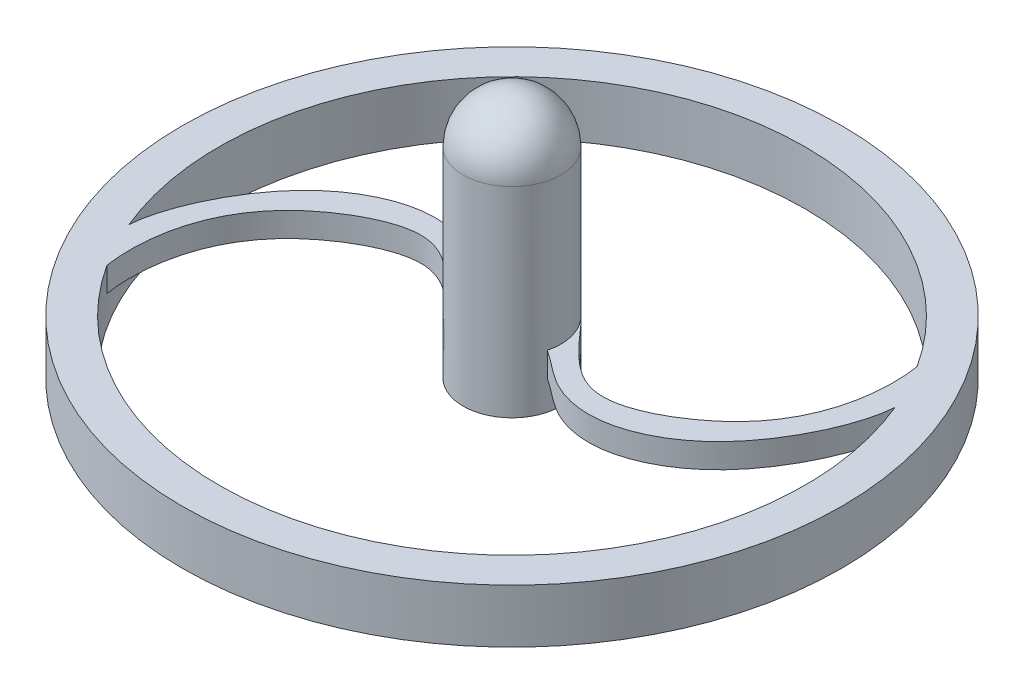
ISO-10303-21;
HEADER;
FILE_DESCRIPTION(('STEP AP214'),'2;1');
FILE_NAME('part.step','',(''),(''),'','','');
FILE_SCHEMA(('AUTOMOTIVE_DESIGN { 1 0 10303 214 1 1 1 1 }'));
ENDSEC;
DATA;
#1=APPLICATION_CONTEXT('core data for automotive mechanical design processes');
#2=APPLICATION_PROTOCOL_DEFINITION('international standard','automotive_design',2000,#1);
#3=PRODUCT_CONTEXT('',#1,'mechanical');
#4=PRODUCT('Part','Part','',(#3));
#5=PRODUCT_RELATED_PRODUCT_CATEGORY('part','',(#4));
#6=PRODUCT_DEFINITION_FORMATION('','',#4);
#7=PRODUCT_DEFINITION_CONTEXT('part definition',#1,'design');
#8=PRODUCT_DEFINITION('design','',#6,#7);
#9=PRODUCT_DEFINITION_SHAPE('','',#8);
#10=(LENGTH_UNIT() NAMED_UNIT(*) SI_UNIT(.MILLI.,.METRE.));
#11=(NAMED_UNIT(*) PLANE_ANGLE_UNIT() SI_UNIT($,.RADIAN.));
#12=(NAMED_UNIT(*) SI_UNIT($,.STERADIAN.) SOLID_ANGLE_UNIT());
#13=UNCERTAINTY_MEASURE_WITH_UNIT(LENGTH_MEASURE(1.E-05),#10,'distance_accuracy_value','');
#14=(GEOMETRIC_REPRESENTATION_CONTEXT(3) GLOBAL_UNCERTAINTY_ASSIGNED_CONTEXT((#13)) GLOBAL_UNIT_ASSIGNED_CONTEXT((#10,
#11,#12)) REPRESENTATION_CONTEXT('',''));
#15=CARTESIAN_POINT('',(0.,0.,0.));
#16=DIRECTION('',(0.,0.,1.));
#17=DIRECTION('',(1.,0.,0.));
#18=AXIS2_PLACEMENT_3D('',#15,#16,#17);
#19=CARTESIAN_POINT('',(0.,0.,0.));
#20=DIRECTION('',(0.,1.,0.));
#21=DIRECTION('',(0.,0.,1.));
#22=AXIS2_PLACEMENT_3D('',#19,#20,#21);
#23=PLANE('',#22);
#24=CARTESIAN_POINT('',(0.,0.,0.));
#25=DIRECTION('',(0.,-1.,0.));
#26=DIRECTION('',(0.,0.,-1.));
#27=AXIS2_PLACEMENT_3D('',#24,#25,#26);
#28=CIRCLE('',#27,2.);
#29=CARTESIAN_POINT('',(-1.16256568490466,0.,1.62740315480896));
#30=VERTEX_POINT('',#29);
#31=CARTESIAN_POINT('',(-1.93836135171429,0.,-0.492702009515219));
#32=VERTEX_POINT('',#31);
#33=EDGE_CURVE('E118',#30,#32,#28,.T.);
#34=ORIENTED_EDGE('',*,*,#33,.F.);
#35=CARTESIAN_POINT('',(-10.0854850638004,0.,6.5033930738959));
#36=CARTESIAN_POINT('',(-10.0854218085389,0.,6.50320334047269));
#37=CARTESIAN_POINT('',(-10.0853585532773,0.,6.50301360704947));
#38=CARTESIAN_POINT('',(-10.0852952980157,0.,6.50282387362626));
#39=CARTESIAN_POINT('',(-10.0842533998892,0.,6.49969871228324));
#40=CARTESIAN_POINT('',(-10.9818624529143,0.,2.08534550251094));
#41=CARTESIAN_POINT('',(-5.36627081813513,0.,-1.29229015669649));
#42=CARTESIAN_POINT('',(-2.94758233561727,0.,-0.67177594075878));
#43=CARTESIAN_POINT('',(-1.6606104801702,0.,1.32002450229677));
#44=CARTESIAN_POINT('',(-1.16256568490466,0.,1.62740315480896));
#45=B_SPLINE_CURVE_WITH_KNOTS('',3,(#35,#36,#37,#38,#39,#40,#41,#42,#43,#44),.UNSPECIFIED.,.F.,
.F.,(4,3,1,1,1,4),(-0.0286616399057449,0.000521976231546366,0.481214873968471,0.664290716261165,
0.779225909611428,1.),.UNSPECIFIED.);
#46=CARTESIAN_POINT('',(-10.0853009999482,0.,6.50282275173211));
#47=VERTEX_POINT('',#46);
#48=EDGE_CURVE('E235',#47,#30,#45,.T.);
#49=ORIENTED_EDGE('',*,*,#48,.F.);
#50=CARTESIAN_POINT('',(0.,0.,0.));
#51=DIRECTION('',(0.,-1.,0.));
#52=DIRECTION('',(0.,0.,-1.));
#53=AXIS2_PLACEMENT_3D('',#50,#51,#52);
#54=CIRCLE('',#53,12.);
#55=CARTESIAN_POINT('',(-11.0822901967786,0.,4.60248237306618));
#56=VERTEX_POINT('',#55);
#57=EDGE_CURVE('E11',#47,#56,#54,.T.);
#58=ORIENTED_EDGE('',*,*,#57,.T.);
#59=CARTESIAN_POINT('',(-1.93836135171429,0.,-0.492702009515219));
#60=CARTESIAN_POINT('',(-2.52199460928083,0.,-0.852903354489393));
#61=CARTESIAN_POINT('',(-3.25646540853267,0.,-1.6835347590675));
#62=CARTESIAN_POINT('',(-5.88510092905891,0.,-2.14010059100438));
#63=CARTESIAN_POINT('',(-9.31960687069204,0.,-0.459678320471755));
#64=CARTESIAN_POINT('',(-11.0084041898084,0.,3.34807400884886));
#65=CARTESIAN_POINT('',(-11.0822901967786,0.,4.60248237306619));
#66=B_SPLINE_CURVE_WITH_KNOTS('',3,(#59,#60,#61,#62,#63,#64,#65),.UNSPECIFIED.,.F.,.F.,(4,1,1,1,
4),(0.,0.258713880673113,0.388227573111131,0.692598248431942,1.),.UNSPECIFIED.);
#67=EDGE_CURVE('E358',#32,#56,#66,.T.);
#68=ORIENTED_EDGE('',*,*,#67,.F.);
#69=EDGE_LOOP('',(#34,#49,#58,#68));
#70=FACE_BOUND('',#69,.T.);
#71=ADVANCED_FACE('F39',(#70),#23,.F.);
#72=CARTESIAN_POINT('',(1.16256568490466,0.,-1.62740315480896));
#73=VERTEX_POINT('',#72);
#74=CARTESIAN_POINT('',(1.93836135171429,0.,0.492702009515219));
#75=VERTEX_POINT('',#74);
#76=EDGE_CURVE('E106',#73,#75,#28,.T.);
#77=ORIENTED_EDGE('',*,*,#76,.F.);
#78=CARTESIAN_POINT('',(10.0854850638004,0.,-6.5033930738959));
#79=CARTESIAN_POINT('',(10.0854218085389,0.,-6.50320334047269));
#80=CARTESIAN_POINT('',(10.0853585532773,0.,-6.50301360704947));
#81=CARTESIAN_POINT('',(10.0852952980157,0.,-6.50282387362626));
#82=CARTESIAN_POINT('',(10.0842533998892,0.,-6.49969871228324));
#83=CARTESIAN_POINT('',(10.9818624529143,0.,-2.08534550251094));
#84=CARTESIAN_POINT('',(5.36627081813513,0.,1.29229015669649));
#85=CARTESIAN_POINT('',(2.94758233561727,0.,0.67177594075878));
#86=CARTESIAN_POINT('',(1.6606104801702,0.,-1.32002450229677));
#87=CARTESIAN_POINT('',(1.16256568490466,0.,-1.62740315480896));
#88=B_SPLINE_CURVE_WITH_KNOTS('',3,(#78,#79,#80,#81,#82,#83,#84,#85,#86,#87),.UNSPECIFIED.,.F.,
.F.,(4,3,1,1,1,4),(-0.0286616399057449,0.000521976231546366,0.481214873968471,0.664290716261165,
0.779225909611428,1.),.UNSPECIFIED.);
#89=CARTESIAN_POINT('',(10.0853009999482,0.,-6.50282275173211));
#90=VERTEX_POINT('',#89);
#91=EDGE_CURVE('E109',#90,#73,#88,.T.);
#92=ORIENTED_EDGE('',*,*,#91,.F.);
#93=CARTESIAN_POINT('',(11.0822901967786,0.,-4.60248237306619));
#94=VERTEX_POINT('',#93);
#95=EDGE_CURVE('E190',#90,#94,#54,.T.);
#96=ORIENTED_EDGE('',*,*,#95,.T.);
#97=CARTESIAN_POINT('',(1.93836135171429,0.,0.492702009515219));
#98=CARTESIAN_POINT('',(2.52199460928083,0.,0.852903354489393));
#99=CARTESIAN_POINT('',(3.25646540853267,0.,1.6835347590675));
#100=CARTESIAN_POINT('',(5.88510092905891,0.,2.14010059100438));
#101=CARTESIAN_POINT('',(9.31960687069204,0.,0.459678320471755));
#102=CARTESIAN_POINT('',(11.0084041898084,0.,-3.34807400884886));
#103=CARTESIAN_POINT('',(11.0822901967786,0.,-4.60248237306619));
#104=B_SPLINE_CURVE_WITH_KNOTS('',3,(#97,#98,#99,#100,#101,#102,#103),.UNSPECIFIED.,.F.,.F.,(4,
1,1,1,4),(0.,0.258713880673113,0.388227573111131,0.692598248431942,1.),.UNSPECIFIED.);
#105=EDGE_CURVE('E112',#75,#94,#104,.T.);
#106=ORIENTED_EDGE('',*,*,#105,.F.);
#107=EDGE_LOOP('',(#77,#92,#96,#106));
#108=FACE_BOUND('',#107,.T.);
#109=ADVANCED_FACE('F108',(#108),#23,.F.);
#110=CARTESIAN_POINT('',(0.,1.,0.));
#111=DIRECTION('',(0.,-1.,0.));
#112=DIRECTION('',(0.,0.,-1.));
#113=AXIS2_PLACEMENT_3D('',#110,#111,#112);
#114=CYLINDRICAL_SURFACE('',#113,13.5);
#115=CARTESIAN_POINT('',(0.,1.,0.));
#116=DIRECTION('',(0.,1.,0.));
#117=DIRECTION('',(0.,0.,1.));
#118=AXIS2_PLACEMENT_3D('',#115,#116,#117);
#119=CIRCLE('',#118,13.5);
#120=CARTESIAN_POINT('',(0.,1.,13.5));
#121=VERTEX_POINT('',#120);
#122=EDGE_CURVE('E359',#121,#121,#119,.T.);
#123=ORIENTED_EDGE('',*,*,#122,.F.);
#124=EDGE_LOOP('',(#123));
#125=FACE_BOUND('',#124,.T.);
#126=CARTESIAN_POINT('',(0.,-1.2,0.));
#127=DIRECTION('',(0.,-1.,0.));
#128=DIRECTION('',(0.,0.,-1.));
#129=AXIS2_PLACEMENT_3D('',#126,#127,#128);
#130=CIRCLE('',#129,13.5);
#131=CARTESIAN_POINT('',(0.,-1.2,-13.5));
#132=VERTEX_POINT('',#131);
#133=EDGE_CURVE('E187',#132,#132,#130,.T.);
#134=ORIENTED_EDGE('',*,*,#133,.F.);
#135=EDGE_LOOP('',(#134));
#136=FACE_BOUND('',#135,.T.);
#137=ADVANCED_FACE('F399',(#125,#136),#114,.T.);
#138=CARTESIAN_POINT('',(-10.0854850638004,1.,6.5033930738959));
#139=CARTESIAN_POINT('',(-10.0854218085389,1.,6.50320334047269));
#140=CARTESIAN_POINT('',(-10.0853585532773,1.,6.50301360704947));
#141=CARTESIAN_POINT('',(-10.0852952980157,1.,6.50282387362626));
#142=CARTESIAN_POINT('',(-10.0842533998892,1.,6.49969871228324));
#143=CARTESIAN_POINT('',(-10.9818624529143,1.,2.08534550251094));
#144=CARTESIAN_POINT('',(-5.36627081813513,1.,-1.29229015669649));
#145=CARTESIAN_POINT('',(-2.94758233561727,1.,-0.67177594075878));
#146=CARTESIAN_POINT('',(-1.6606104801702,1.,1.32002450229677));
#147=CARTESIAN_POINT('',(-1.16256568490466,1.,1.62740315480896));
#148=B_SPLINE_CURVE_WITH_KNOTS('',3,(#138,#139,#140,#141,#142,#143,#144,#145,#146,#147),
.UNSPECIFIED.,.F.,.F.,(4,3,1,1,1,4),(-0.0286616399057449,0.000521976231546366,0.481214873968471,
0.664290716261165,0.779225909611428,1.),.UNSPECIFIED.);
#149=DIRECTION('',(0.,-1.,0.));
#150=VECTOR('',#149,1.);
#151=SURFACE_OF_LINEAR_EXTRUSION('',#148,#150);
#152=ORIENTED_EDGE('',*,*,#48,.T.);
#153=CARTESIAN_POINT('',(-1.16256568490466,0.,1.62740315480896));
#154=DIRECTION('',(0.,1.,0.));
#155=VECTOR('',#154,1.);
#156=LINE('',#153,#155);
#157=CARTESIAN_POINT('',(-1.16256568490466,1.,1.62740315480896));
#158=VERTEX_POINT('',#157);
#159=EDGE_CURVE('E199',#158,#30,#156,.F.);
#160=ORIENTED_EDGE('',*,*,#159,.F.);
#161=CARTESIAN_POINT('',(-1.16256568490466,1.,1.62740315480896));
#162=CARTESIAN_POINT('',(-1.6606104801702,1.,1.32002450229677));
#163=CARTESIAN_POINT('',(-2.94758233561727,1.,-0.67177594075878));
#164=CARTESIAN_POINT('',(-5.36627081813513,1.,-1.29229015669649));
#165=CARTESIAN_POINT('',(-10.9818624529143,1.,2.08534550251094));
#166=CARTESIAN_POINT('',(-10.0842533998892,1.,6.49969871228324));
#167=CARTESIAN_POINT('',(-10.0852952980157,1.,6.50282387362626));
#168=CARTESIAN_POINT('',(-10.0853585532773,1.,6.50301360704947));
#169=CARTESIAN_POINT('',(-10.0854218085389,1.,6.50320334047269));
#170=CARTESIAN_POINT('',(-10.0854850638004,1.,6.5033930738959));
#171=B_SPLINE_CURVE_WITH_KNOTS('',3,(#161,#162,#163,#164,#165,#166,#167,#168,#169,#170),
.UNSPECIFIED.,.F.,.F.,(4,1,1,1,3,4),(-0.0286616399057449,0.192112450482827,0.30704764383309,
0.490123486125784,0.970816383862709,1.),.UNSPECIFIED.);
#172=CARTESIAN_POINT('',(-10.0853009999482,1.,6.50282275173211));
#173=VERTEX_POINT('',#172);
#174=EDGE_CURVE('E217',#173,#158,#171,.F.);
#175=ORIENTED_EDGE('',*,*,#174,.F.);
#176=CARTESIAN_POINT('',(-10.0852960749958,1.,6.50282620416895));
#177=DIRECTION('',(0.,-1.,0.));
#178=VECTOR('',#177,1.);
#179=LINE('',#176,#178);
#180=EDGE_CURVE('E196',#173,#47,#179,.T.);
#181=ORIENTED_EDGE('',*,*,#180,.T.);
#182=EDGE_LOOP('',(#152,#160,#175,#181));
#183=FACE_BOUND('',#182,.T.);
#184=ADVANCED_FACE('F161',(#183),#151,.F.);
#185=CARTESIAN_POINT('',(0.,1.,0.));
#186=DIRECTION('',(0.,-1.,0.));
#187=DIRECTION('',(0.,0.,-1.));
#188=AXIS2_PLACEMENT_3D('',#185,#186,#187);
#189=CYLINDRICAL_SURFACE('',#188,2.);
#190=ORIENTED_EDGE('',*,*,#33,.T.);
#191=DIRECTION('',(0.,-1.,0.));
#192=VECTOR('',#191,1.);
#193=CARTESIAN_POINT('',(-1.93836135171429,1.,-0.492702009515219));
#194=LINE('',#193,#192);
#195=CARTESIAN_POINT('',(-1.93836135171429,1.,-0.492702009515219));
#196=VERTEX_POINT('',#195);
#197=EDGE_CURVE('E205',#196,#32,#194,.T.);
#198=ORIENTED_EDGE('',*,*,#197,.F.);
#199=CARTESIAN_POINT('',(0.,1.,0.));
#200=DIRECTION('',(0.,1.,0.));
#201=DIRECTION('',(0.,0.,1.));
#202=AXIS2_PLACEMENT_3D('',#199,#200,#201);
#203=CIRCLE('',#202,2.);
#204=EDGE_CURVE('E63',#196,#158,#203,.T.);
#205=ORIENTED_EDGE('',*,*,#204,.T.);
#206=ORIENTED_EDGE('',*,*,#159,.T.);
#207=EDGE_LOOP('',(#190,#198,#205,#206));
#208=FACE_BOUND('',#207,.T.);
#209=CARTESIAN_POINT('',(0.,7.,0.));
#210=DIRECTION('',(0.,-1.,0.));
#211=DIRECTION('',(0.,0.,-1.));
#212=AXIS2_PLACEMENT_3D('',#209,#210,#211);
#213=CIRCLE('',#212,2.);
#214=CARTESIAN_POINT('',(0.,7.,-2.));
#215=VERTEX_POINT('',#214);
#216=EDGE_CURVE('E50',#215,#215,#213,.T.);
#217=ORIENTED_EDGE('',*,*,#216,.T.);
#218=EDGE_LOOP('',(#217));
#219=FACE_BOUND('',#218,.T.);
#220=CARTESIAN_POINT('',(1.16256568490466,0.,-1.62740315480896));
#221=DIRECTION('',(0.,1.,0.));
#222=VECTOR('',#221,1.);
#223=LINE('',#220,#222);
#224=CARTESIAN_POINT('',(1.16256568490466,1.,-1.62740315480896));
#225=VERTEX_POINT('',#224);
#226=EDGE_CURVE('E126',#225,#73,#223,.F.);
#227=ORIENTED_EDGE('',*,*,#226,.T.);
#228=ORIENTED_EDGE('',*,*,#76,.T.);
#229=DIRECTION('',(0.,-1.,0.));
#230=VECTOR('',#229,1.);
#231=CARTESIAN_POINT('',(1.93836135171429,1.,0.492702009515219));
#232=LINE('',#231,#230);
#233=CARTESIAN_POINT('',(1.93836135171429,1.,0.492702009515219));
#234=VERTEX_POINT('',#233);
#235=EDGE_CURVE('E139',#234,#75,#232,.T.);
#236=ORIENTED_EDGE('',*,*,#235,.F.);
#237=EDGE_CURVE('E132',#234,#225,#203,.T.);
#238=ORIENTED_EDGE('',*,*,#237,.T.);
#239=EDGE_LOOP('',(#227,#228,#236,#238));
#240=FACE_BOUND('',#239,.T.);
#241=CARTESIAN_POINT('',(0.,-1.2,0.));
#242=DIRECTION('',(0.,-1.,0.));
#243=DIRECTION('',(0.,0.,-1.));
#244=AXIS2_PLACEMENT_3D('',#241,#242,#243);
#245=CIRCLE('',#244,2.);
#246=CARTESIAN_POINT('',(0.,-1.2,-2.));
#247=VERTEX_POINT('',#246);
#248=EDGE_CURVE('E117',#247,#247,#245,.T.);
#249=ORIENTED_EDGE('',*,*,#248,.F.);
#250=EDGE_LOOP('',(#249));
#251=FACE_BOUND('',#250,.T.);
#252=ADVANCED_FACE('F136',(#208,#219,#240,#251),#189,.T.);
#253=CARTESIAN_POINT('',(-1.93836135171429,1.,-0.492702009515219));
#254=CARTESIAN_POINT('',(-2.52199460928083,1.,-0.852903354489393));
#255=CARTESIAN_POINT('',(-3.25646540853267,1.,-1.6835347590675));
#256=CARTESIAN_POINT('',(-5.88510092905891,1.,-2.14010059100438));
#257=CARTESIAN_POINT('',(-9.31960687069204,1.,-0.459678320471755));
#258=CARTESIAN_POINT('',(-11.0084041898084,1.,3.34807400884886));
#259=CARTESIAN_POINT('',(-11.0822901967786,1.,4.60248237306619));
#260=B_SPLINE_CURVE_WITH_KNOTS('',3,(#253,#254,#255,#256,#257,#258,#259),.UNSPECIFIED.,.F.,.F.,
(4,1,1,1,4),(0.,0.258713880673113,0.388227573111131,0.692598248431942,1.),.UNSPECIFIED.);
#261=DIRECTION('',(0.,-1.,0.));
#262=VECTOR('',#261,1.);
#263=SURFACE_OF_LINEAR_EXTRUSION('',#260,#262);
#264=ORIENTED_EDGE('',*,*,#67,.T.);
#265=DIRECTION('',(0.,-1.,0.));
#266=VECTOR('',#265,1.);
#267=CARTESIAN_POINT('',(-11.0822901967786,1.,4.60248237306618));
#268=LINE('',#267,#266);
#269=CARTESIAN_POINT('',(-11.0822901967786,1.,4.60248237306618));
#270=VERTEX_POINT('',#269);
#271=EDGE_CURVE('E208',#270,#56,#268,.T.);
#272=ORIENTED_EDGE('',*,*,#271,.F.);
#273=EDGE_CURVE('E58',#196,#270,#260,.T.);
#274=ORIENTED_EDGE('',*,*,#273,.F.);
#275=ORIENTED_EDGE('',*,*,#197,.T.);
#276=EDGE_LOOP('',(#264,#272,#274,#275));
#277=FACE_BOUND('',#276,.T.);
#278=ADVANCED_FACE('F160',(#277),#263,.F.);
#279=CARTESIAN_POINT('',(0.,1.,0.));
#280=DIRECTION('',(0.,-1.,0.));
#281=DIRECTION('',(0.,0.,-1.));
#282=AXIS2_PLACEMENT_3D('',#279,#280,#281);
#283=CYLINDRICAL_SURFACE('',#282,12.);
#284=ORIENTED_EDGE('',*,*,#271,.T.);
#285=ORIENTED_EDGE('',*,*,#57,.F.);
#286=ORIENTED_EDGE('',*,*,#180,.F.);
#287=CARTESIAN_POINT('',(0.,1.,0.));
#288=DIRECTION('',(0.,-1.,0.));
#289=DIRECTION('',(0.,0.,-1.));
#290=AXIS2_PLACEMENT_3D('',#287,#288,#289);
#291=CIRCLE('',#290,12.);
#292=CARTESIAN_POINT('',(11.0822901967786,1.,-4.60248237306618));
#293=VERTEX_POINT('',#292);
#294=EDGE_CURVE('E326',#293,#173,#291,.T.);
#295=ORIENTED_EDGE('',*,*,#294,.F.);
#296=DIRECTION('',(0.,-1.,0.));
#297=VECTOR('',#296,1.);
#298=CARTESIAN_POINT('',(11.0822901967786,1.,-4.60248237306618));
#299=LINE('',#298,#297);
#300=EDGE_CURVE('E313',#293,#94,#299,.T.);
#301=ORIENTED_EDGE('',*,*,#300,.T.);
#302=ORIENTED_EDGE('',*,*,#95,.F.);
#303=CARTESIAN_POINT('',(10.0852960749958,1.,-6.50282620416895));
#304=DIRECTION('',(0.,-1.,0.));
#305=VECTOR('',#304,1.);
#306=LINE('',#303,#305);
#307=CARTESIAN_POINT('',(10.0853009999482,1.,-6.50282275173211));
#308=VERTEX_POINT('',#307);
#309=EDGE_CURVE('E130',#308,#90,#306,.T.);
#310=ORIENTED_EDGE('',*,*,#309,.F.);
#311=CARTESIAN_POINT('',(0.,1.,0.));
#312=DIRECTION('',(0.,-1.,0.));
#313=DIRECTION('',(0.,0.,1.));
#314=AXIS2_PLACEMENT_3D('',#311,#312,#313);
#315=CIRCLE('',#314,12.);
#316=EDGE_CURVE('E149',#270,#308,#315,.T.);
#317=ORIENTED_EDGE('',*,*,#316,.F.);
#318=EDGE_LOOP('',(#284,#285,#286,#295,#301,#302,#310,#317));
#319=FACE_BOUND('',#318,.T.);
#320=CARTESIAN_POINT('',(0.,-1.2,0.));
#321=DIRECTION('',(0.,-1.,0.));
#322=DIRECTION('',(0.,0.,-1.));
#323=AXIS2_PLACEMENT_3D('',#320,#321,#322);
#324=CIRCLE('',#323,12.);
#325=CARTESIAN_POINT('',(0.,-1.2,-12.));
#326=VERTEX_POINT('',#325);
#327=EDGE_CURVE('E185',#326,#326,#324,.T.);
#328=ORIENTED_EDGE('',*,*,#327,.T.);
#329=EDGE_LOOP('',(#328));
#330=FACE_BOUND('',#329,.T.);
#331=ADVANCED_FACE('F262',(#319,#330),#283,.F.);
#332=CARTESIAN_POINT('',(0.,1.,0.));
#333=DIRECTION('',(0.,1.,0.));
#334=DIRECTION('',(0.,0.,1.));
#335=AXIS2_PLACEMENT_3D('',#332,#333,#334);
#336=PLANE('',#335);
#337=ORIENTED_EDGE('',*,*,#237,.F.);
#338=CARTESIAN_POINT('',(1.93836135171429,1.,0.492702009515219));
#339=CARTESIAN_POINT('',(2.52199460928083,1.,0.852903354489393));
#340=CARTESIAN_POINT('',(3.25646540853267,1.,1.6835347590675));
#341=CARTESIAN_POINT('',(5.88510092905891,1.,2.14010059100438));
#342=CARTESIAN_POINT('',(9.31960687069204,1.,0.459678320471755));
#343=CARTESIAN_POINT('',(11.0084041898084,1.,-3.34807400884886));
#344=CARTESIAN_POINT('',(11.0822901967786,1.,-4.60248237306619));
#345=B_SPLINE_CURVE_WITH_KNOTS('',3,(#338,#339,#340,#341,#342,#343,#344),.UNSPECIFIED.,.F.,.F.,
(4,1,1,1,4),(0.,0.258713880673113,0.388227573111131,0.692598248431942,1.),.UNSPECIFIED.);
#346=EDGE_CURVE('E288',#234,#293,#345,.T.);
#347=ORIENTED_EDGE('',*,*,#346,.T.);
#348=ORIENTED_EDGE('',*,*,#294,.T.);
#349=ORIENTED_EDGE('',*,*,#174,.T.);
#350=ORIENTED_EDGE('',*,*,#204,.F.);
#351=ORIENTED_EDGE('',*,*,#273,.T.);
#352=ORIENTED_EDGE('',*,*,#316,.T.);
#353=CARTESIAN_POINT('',(1.16256568490466,1.,-1.62740315480896));
#354=CARTESIAN_POINT('',(1.6606104801702,1.,-1.32002450229677));
#355=CARTESIAN_POINT('',(2.94758233561727,1.,0.67177594075878));
#356=CARTESIAN_POINT('',(5.36627081813513,1.,1.29229015669649));
#357=CARTESIAN_POINT('',(10.9818624529143,1.,-2.08534550251094));
#358=CARTESIAN_POINT('',(10.0842533998892,1.,-6.49969871228324));
#359=CARTESIAN_POINT('',(10.0852952980157,1.,-6.50282387362626));
#360=CARTESIAN_POINT('',(10.0853585532773,1.,-6.50301360704947));
#361=CARTESIAN_POINT('',(10.0854218085389,1.,-6.50320334047269));
#362=CARTESIAN_POINT('',(10.0854850638004,1.,-6.5033930738959));
#363=B_SPLINE_CURVE_WITH_KNOTS('',3,(#353,#354,#355,#356,#357,#358,#359,#360,#361,#362),
.UNSPECIFIED.,.F.,.F.,(4,1,1,1,3,4),(-0.0286616399057449,0.192112450482827,0.30704764383309,
0.490123486125784,0.970816383862709,1.),.UNSPECIFIED.);
#364=EDGE_CURVE('E275',#308,#225,#363,.F.);
#365=ORIENTED_EDGE('',*,*,#364,.T.);
#366=EDGE_LOOP('',(#337,#347,#348,#349,#350,#351,#352,#365));
#367=FACE_BOUND('',#366,.T.);
#368=ORIENTED_EDGE('',*,*,#122,.T.);
#369=EDGE_LOOP('',(#368));
#370=FACE_BOUND('',#369,.T.);
#371=ADVANCED_FACE('F259',(#367,#370),#336,.T.);
#372=CARTESIAN_POINT('',(10.0854850638004,1.,-6.5033930738959));
#373=CARTESIAN_POINT('',(10.0854218085389,1.,-6.50320334047269));
#374=CARTESIAN_POINT('',(10.0853585532773,1.,-6.50301360704947));
#375=CARTESIAN_POINT('',(10.0852952980157,1.,-6.50282387362626));
#376=CARTESIAN_POINT('',(10.0842533998892,1.,-6.49969871228324));
#377=CARTESIAN_POINT('',(10.9818624529143,1.,-2.08534550251094));
#378=CARTESIAN_POINT('',(5.36627081813513,1.,1.29229015669649));
#379=CARTESIAN_POINT('',(2.94758233561727,1.,0.67177594075878));
#380=CARTESIAN_POINT('',(1.6606104801702,1.,-1.32002450229677));
#381=CARTESIAN_POINT('',(1.16256568490466,1.,-1.62740315480896));
#382=B_SPLINE_CURVE_WITH_KNOTS('',3,(#372,#373,#374,#375,#376,#377,#378,#379,#380,#381),
.UNSPECIFIED.,.F.,.F.,(4,3,1,1,1,4),(-0.0286616399057449,0.000521976231546366,0.481214873968471,
0.664290716261165,0.779225909611428,1.),.UNSPECIFIED.);
#383=DIRECTION('',(0.,-1.,0.));
#384=VECTOR('',#383,1.);
#385=SURFACE_OF_LINEAR_EXTRUSION('',#382,#384);
#386=ORIENTED_EDGE('',*,*,#91,.T.);
#387=ORIENTED_EDGE('',*,*,#226,.F.);
#388=ORIENTED_EDGE('',*,*,#364,.F.);
#389=ORIENTED_EDGE('',*,*,#309,.T.);
#390=EDGE_LOOP('',(#386,#387,#388,#389));
#391=FACE_BOUND('',#390,.T.);
#392=ADVANCED_FACE('F124',(#391),#385,.F.);
#393=DIRECTION('',(0.,-1.,0.));
#394=VECTOR('',#393,1.);
#395=SURFACE_OF_LINEAR_EXTRUSION('',#345,#394);
#396=ORIENTED_EDGE('',*,*,#105,.T.);
#397=ORIENTED_EDGE('',*,*,#300,.F.);
#398=ORIENTED_EDGE('',*,*,#346,.F.);
#399=ORIENTED_EDGE('',*,*,#235,.T.);
#400=EDGE_LOOP('',(#396,#397,#398,#399));
#401=FACE_BOUND('',#400,.T.);
#402=ADVANCED_FACE('F303',(#401),#395,.F.);
#403=CARTESIAN_POINT('',(0.,7.,0.));
#404=DIRECTION('',(0.,1.,0.));
#405=DIRECTION('',(0.,0.,1.));
#406=AXIS2_PLACEMENT_3D('',#403,#404,#405);
#407=SPHERICAL_SURFACE('',#406,2.);
#408=ORIENTED_EDGE('',*,*,#216,.F.);
#409=EDGE_LOOP('',(#408));
#410=FACE_BOUND('',#409,.T.);
#411=ADVANCED_FACE('F41',(#410),#407,.T.);
#412=CARTESIAN_POINT('',(0.,-1.2,0.));
#413=DIRECTION('',(0.,-1.,0.));
#414=DIRECTION('',(0.,0.,-1.));
#415=AXIS2_PLACEMENT_3D('',#412,#413,#414);
#416=PLANE('',#415);
#417=ORIENTED_EDGE('',*,*,#133,.T.);
#418=EDGE_LOOP('',(#417));
#419=FACE_BOUND('',#418,.T.);
#420=ORIENTED_EDGE('',*,*,#327,.F.);
#421=EDGE_LOOP('',(#420));
#422=FACE_BOUND('',#421,.T.);
#423=ADVANCED_FACE('F332',(#419,#422),#416,.T.);
#424=CARTESIAN_POINT('',(0.,-1.2,0.));
#425=DIRECTION('',(0.,-1.,0.));
#426=DIRECTION('',(0.,0.,-1.));
#427=AXIS2_PLACEMENT_3D('',#424,#425,#426);
#428=PLANE('',#427);
#429=ORIENTED_EDGE('',*,*,#248,.T.);
#430=EDGE_LOOP('',(#429));
#431=FACE_BOUND('',#430,.T.);
#432=ADVANCED_FACE('F337',(#431),#428,.T.);
#433=CLOSED_SHELL('',(#71,#109,#137,#184,#252,#278,#331,#371,#392,#402,#411,#423,#432));
#434=MANIFOLD_SOLID_BREP('B2',#433);
#435=ADVANCED_BREP_SHAPE_REPRESENTATION('',(#18,#434),#14);
#436=SHAPE_DEFINITION_REPRESENTATION(#9,#435);
ENDSEC;
END-ISO-10303-21;
